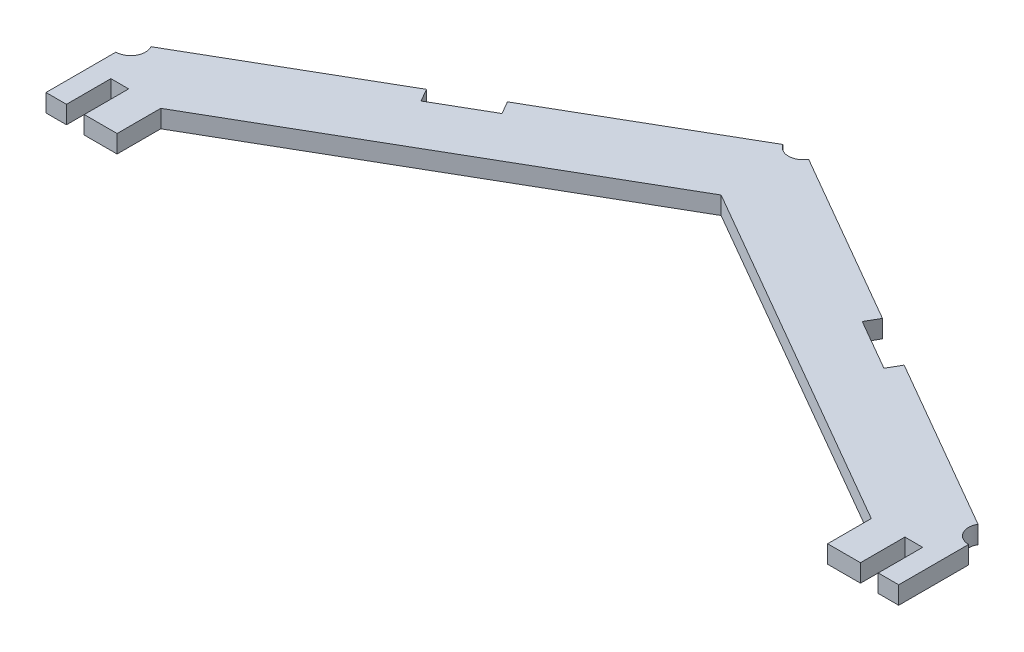
ISO-10303-21;
HEADER;
FILE_DESCRIPTION(('STEP AP214'),'2;1');
FILE_NAME('part.step','',(''),(''),'','','');
FILE_SCHEMA(('AUTOMOTIVE_DESIGN { 1 0 10303 214 1 1 1 1 }'));
ENDSEC;
DATA;
#1=APPLICATION_CONTEXT('core data for automotive mechanical design processes');
#2=APPLICATION_PROTOCOL_DEFINITION('international standard','automotive_design',2000,#1);
#3=PRODUCT_CONTEXT('',#1,'mechanical');
#4=PRODUCT('Part','Part','',(#3));
#5=PRODUCT_RELATED_PRODUCT_CATEGORY('part','',(#4));
#6=PRODUCT_DEFINITION_FORMATION('','',#4);
#7=PRODUCT_DEFINITION_CONTEXT('part definition',#1,'design');
#8=PRODUCT_DEFINITION('design','',#6,#7);
#9=PRODUCT_DEFINITION_SHAPE('','',#8);
#10=(LENGTH_UNIT() NAMED_UNIT(*) SI_UNIT(.MILLI.,.METRE.));
#11=(NAMED_UNIT(*) PLANE_ANGLE_UNIT() SI_UNIT($,.RADIAN.));
#12=(NAMED_UNIT(*) SI_UNIT($,.STERADIAN.) SOLID_ANGLE_UNIT());
#13=UNCERTAINTY_MEASURE_WITH_UNIT(LENGTH_MEASURE(1.E-05),#10,'distance_accuracy_value','');
#14=(GEOMETRIC_REPRESENTATION_CONTEXT(3) GLOBAL_UNCERTAINTY_ASSIGNED_CONTEXT((#13)) GLOBAL_UNIT_ASSIGNED_CONTEXT((#10,
#11,#12)) REPRESENTATION_CONTEXT('',''));
#15=CARTESIAN_POINT('',(0.,0.,0.));
#16=DIRECTION('',(0.,0.,1.));
#17=DIRECTION('',(1.,0.,0.));
#18=AXIS2_PLACEMENT_3D('',#15,#16,#17);
#19=CARTESIAN_POINT('',(-71.9715242270662,-21.,-27.25));
#20=DIRECTION('',(0.,-1.,0.));
#21=DIRECTION('',(0.,0.,-1.));
#22=AXIS2_PLACEMENT_3D('',#19,#20,#21);
#23=PLANE('',#22);
#24=DIRECTION('',(0.866025403784439,0.,0.5));
#25=VECTOR('',#24,1.);
#26=CARTESIAN_POINT('',(71.9615242270662,-21.,-41.5470053837925));
#27=LINE('',#26,#25);
#28=CARTESIAN_POINT('',(40.3108891324556,-21.,-59.8205080756885));
#29=VERTEX_POINT('',#28);
#30=CARTESIAN_POINT('',(69.7964607176053,-21.,-42.7970053837924));
#31=VERTEX_POINT('',#30);
#32=EDGE_CURVE('E482',#29,#31,#27,.T.);
#33=ORIENTED_EDGE('',*,*,#32,.F.);
#34=DIRECTION('',(0.500000000000006,0.,-0.866025403784435));
#35=VECTOR('',#34,1.);
#36=CARTESIAN_POINT('',(39.0608891324556,-21.,-57.6554445662274));
#37=LINE('',#36,#35);
#38=CARTESIAN_POINT('',(39.0608891324556,-21.,-57.6554445662274));
#39=VERTEX_POINT('',#38);
#40=EDGE_CURVE('E480',#39,#29,#37,.T.);
#41=ORIENTED_EDGE('',*,*,#40,.F.);
#42=DIRECTION('',(0.866025403784436,0.,0.500000000000005));
#43=VECTOR('',#42,1.);
#44=CARTESIAN_POINT('',(39.0608891324556,-21.,-57.6554445662274));
#45=LINE('',#44,#43);
#46=CARTESIAN_POINT('',(30.4006350946112,-21.,-62.6554445662274));
#47=VERTEX_POINT('',#46);
#48=EDGE_CURVE('E478',#47,#39,#45,.T.);
#49=ORIENTED_EDGE('',*,*,#48,.F.);
#50=DIRECTION('',(-0.500000000000005,0.,0.866025403784436));
#51=VECTOR('',#50,1.);
#52=CARTESIAN_POINT('',(30.4006350946112,-21.,-62.6554445662274));
#53=LINE('',#52,#51);
#54=CARTESIAN_POINT('',(31.6506350946112,-21.,-64.8205080756885));
#55=VERTEX_POINT('',#54);
#56=EDGE_CURVE('E476',#55,#47,#53,.T.);
#57=ORIENTED_EDGE('',*,*,#56,.F.);
#58=DIRECTION('',(0.866025403784439,0.,0.5));
#59=VECTOR('',#58,1.);
#60=CARTESIAN_POINT('',(71.9615242270662,-21.,-41.5470053837925));
#61=LINE('',#60,#59);
#62=CARTESIAN_POINT('',(2.1650635094611,-21.,-81.8440107675849));
#63=VERTEX_POINT('',#62);
#64=EDGE_CURVE('E474',#63,#55,#61,.T.);
#65=ORIENTED_EDGE('',*,*,#64,.F.);
#66=CARTESIAN_POINT('',(0.,-21.,-83.0940107675849));
#67=DIRECTION('',(0.,-1.,0.));
#68=DIRECTION('',(0.,0.,-1.));
#69=AXIS2_PLACEMENT_3D('',#66,#67,#68);
#70=CIRCLE('',#69,2.5);
#71=CARTESIAN_POINT('',(-2.16506350946109,-21.,-81.8440107675849));
#72=VERTEX_POINT('',#71);
#73=EDGE_CURVE('E472',#72,#63,#70,.F.);
#74=ORIENTED_EDGE('',*,*,#73,.F.);
#75=DIRECTION('',(0.866025403784439,0.,-0.5));
#76=VECTOR('',#75,1.);
#77=CARTESIAN_POINT('',(0.,-21.,-83.0940107675849));
#78=LINE('',#77,#76);
#79=CARTESIAN_POINT('',(-31.6506350946108,-21.,-64.8205080756888));
#80=VERTEX_POINT('',#79);
#81=EDGE_CURVE('E470',#80,#72,#78,.T.);
#82=ORIENTED_EDGE('',*,*,#81,.F.);
#83=DIRECTION('',(-0.499999999999999,0.,-0.866025403784439));
#84=VECTOR('',#83,1.);
#85=CARTESIAN_POINT('',(-30.4006350946108,-21.,-62.6554445662276));
#86=LINE('',#85,#84);
#87=CARTESIAN_POINT('',(-30.4006350946108,-21.,-62.6554445662276));
#88=VERTEX_POINT('',#87);
#89=EDGE_CURVE('E468',#88,#80,#86,.T.);
#90=ORIENTED_EDGE('',*,*,#89,.F.);
#91=DIRECTION('',(0.86602540378444,0.,-0.499999999999998));
#92=VECTOR('',#91,1.);
#93=CARTESIAN_POINT('',(-30.4006350946108,-21.,-62.6554445662276));
#94=LINE('',#93,#92);
#95=CARTESIAN_POINT('',(-39.0608891324552,-21.,-57.6554445662277));
#96=VERTEX_POINT('',#95);
#97=EDGE_CURVE('E466',#96,#88,#94,.T.);
#98=ORIENTED_EDGE('',*,*,#97,.F.);
#99=DIRECTION('',(0.499999999999999,0.,0.866025403784439));
#100=VECTOR('',#99,1.);
#101=CARTESIAN_POINT('',(-39.0608891324552,-21.,-57.6554445662277));
#102=LINE('',#101,#100);
#103=CARTESIAN_POINT('',(-40.3108891324552,-21.,-59.8205080756888));
#104=VERTEX_POINT('',#103);
#105=EDGE_CURVE('E464',#104,#96,#102,.T.);
#106=ORIENTED_EDGE('',*,*,#105,.F.);
#107=DIRECTION('',(0.866025403784439,0.,-0.5));
#108=VECTOR('',#107,1.);
#109=CARTESIAN_POINT('',(0.,-21.,-83.0940107675849));
#110=LINE('',#109,#108);
#111=CARTESIAN_POINT('',(-69.7964607176044,-21.,-42.7970053837929));
#112=VERTEX_POINT('',#111);
#113=EDGE_CURVE('E460',#112,#104,#110,.T.);
#114=ORIENTED_EDGE('',*,*,#113,.F.);
#115=CARTESIAN_POINT('',(-71.9615242270657,-21.,-41.5470053837933));
#116=DIRECTION('',(0.,-1.,0.));
#117=DIRECTION('',(0.,0.,-1.));
#118=AXIS2_PLACEMENT_3D('',#115,#116,#117);
#119=CIRCLE('',#118,2.5);
#120=CARTESIAN_POINT('',(-71.9615242270662,-21.,-39.0470053837933));
#121=VERTEX_POINT('',#120);
#122=EDGE_CURVE('E454',#121,#112,#119,.F.);
#123=ORIENTED_EDGE('',*,*,#122,.F.);
#124=DIRECTION('',(0.,0.,-1.));
#125=VECTOR('',#124,1.);
#126=CARTESIAN_POINT('',(-71.9615242270662,-21.,-41.5470053837925));
#127=LINE('',#126,#125);
#128=CARTESIAN_POINT('',(-71.9615242270662,-21.,-27.25));
#129=VERTEX_POINT('',#128);
#130=EDGE_CURVE('E451',#129,#121,#127,.T.);
#131=ORIENTED_EDGE('',*,*,#130,.F.);
#132=DIRECTION('',(1.,0.,0.));
#133=VECTOR('',#132,1.);
#134=CARTESIAN_POINT('',(-113.272742430532,-21.,-27.25));
#135=LINE('',#134,#133);
#136=CARTESIAN_POINT('',(-68.5064315060166,-21.,-27.25));
#137=VERTEX_POINT('',#136);
#138=EDGE_CURVE('E416',#129,#137,#135,.T.);
#139=ORIENTED_EDGE('',*,*,#138,.T.);
#140=DIRECTION('',(0.,0.,1.));
#141=VECTOR('',#140,1.);
#142=CARTESIAN_POINT('',(-68.5064315060166,-21.,-34.75));
#143=LINE('',#142,#141);
#144=CARTESIAN_POINT('',(-68.5064315060166,-21.,-34.75));
#145=VERTEX_POINT('',#144);
#146=EDGE_CURVE('E443',#145,#137,#143,.T.);
#147=ORIENTED_EDGE('',*,*,#146,.F.);
#148=DIRECTION('',(-1.,0.,0.));
#149=VECTOR('',#148,1.);
#150=CARTESIAN_POINT('',(-68.5064315060166,-21.,-34.75));
#151=LINE('',#150,#149);
#152=CARTESIAN_POINT('',(-65.5064315060166,-21.,-34.75));
#153=VERTEX_POINT('',#152);
#154=EDGE_CURVE('E446',#153,#145,#151,.T.);
#155=ORIENTED_EDGE('',*,*,#154,.F.);
#156=DIRECTION('',(0.,0.,-1.));
#157=VECTOR('',#156,1.);
#158=CARTESIAN_POINT('',(-65.5064315060166,-21.,-34.75));
#159=LINE('',#158,#157);
#160=CARTESIAN_POINT('',(-65.5064315060166,-21.,-27.25));
#161=VERTEX_POINT('',#160);
#162=EDGE_CURVE('E67',#161,#153,#159,.T.);
#163=ORIENTED_EDGE('',*,*,#162,.F.);
#164=DIRECTION('',(1.,0.,0.));
#165=VECTOR('',#164,1.);
#166=CARTESIAN_POINT('',(-113.272742430532,-21.,-27.25));
#167=LINE('',#166,#165);
#168=CARTESIAN_POINT('',(-59.9615242270663,-21.,-27.25));
#169=VERTEX_POINT('',#168);
#170=EDGE_CURVE('E60',#161,#169,#167,.T.);
#171=ORIENTED_EDGE('',*,*,#170,.T.);
#172=DIRECTION('',(0.,0.,-1.));
#173=VECTOR('',#172,1.);
#174=CARTESIAN_POINT('',(-59.9615242270663,-21.,34.6188021535168));
#175=LINE('',#174,#173);
#176=CARTESIAN_POINT('',(-59.9615242270663,-21.,-34.6188021535169));
#177=VERTEX_POINT('',#176);
#178=EDGE_CURVE('E238',#169,#177,#175,.T.);
#179=ORIENTED_EDGE('',*,*,#178,.T.);
#180=DIRECTION('',(0.866025403784439,0.,-0.5));
#181=VECTOR('',#180,1.);
#182=CARTESIAN_POINT('',(-59.9615242270663,-21.,-34.6188021535169));
#183=LINE('',#182,#181);
#184=CARTESIAN_POINT('',(0.,-21.,-69.2376043070339));
#185=VERTEX_POINT('',#184);
#186=EDGE_CURVE('E333',#177,#185,#183,.T.);
#187=ORIENTED_EDGE('',*,*,#186,.T.);
#188=DIRECTION('',(0.866025403784439,0.,0.5));
#189=VECTOR('',#188,1.);
#190=CARTESIAN_POINT('',(0.,-21.,-69.2376043070339));
#191=LINE('',#190,#189);
#192=CARTESIAN_POINT('',(59.9615242270662,-21.,-34.618802153517));
#193=VERTEX_POINT('',#192);
#194=EDGE_CURVE('E249',#185,#193,#191,.T.);
#195=ORIENTED_EDGE('',*,*,#194,.T.);
#196=DIRECTION('',(0.,0.,1.));
#197=VECTOR('',#196,1.);
#198=CARTESIAN_POINT('',(59.9615242270662,-21.,-34.618802153517));
#199=LINE('',#198,#197);
#200=CARTESIAN_POINT('',(59.9615242270662,-21.,-27.25));
#201=VERTEX_POINT('',#200);
#202=EDGE_CURVE('E47',#193,#201,#199,.T.);
#203=ORIENTED_EDGE('',*,*,#202,.T.);
#204=DIRECTION('',(1.,0.,0.));
#205=VECTOR('',#204,1.);
#206=CARTESIAN_POINT('',(-113.272742430532,-21.,-27.25));
#207=LINE('',#206,#205);
#208=CARTESIAN_POINT('',(65.5064315060166,-21.,-27.25));
#209=VERTEX_POINT('',#208);
#210=EDGE_CURVE('E248',#201,#209,#207,.T.);
#211=ORIENTED_EDGE('',*,*,#210,.T.);
#212=DIRECTION('',(0.,0.,1.));
#213=VECTOR('',#212,1.);
#214=CARTESIAN_POINT('',(65.5064315060166,-21.,-34.75));
#215=LINE('',#214,#213);
#216=CARTESIAN_POINT('',(65.5064315060166,-21.,-34.75));
#217=VERTEX_POINT('',#216);
#218=EDGE_CURVE('E437',#217,#209,#215,.T.);
#219=ORIENTED_EDGE('',*,*,#218,.F.);
#220=DIRECTION('',(-1.,0.,0.));
#221=VECTOR('',#220,1.);
#222=CARTESIAN_POINT('',(68.5064315060166,-21.,-34.75));
#223=LINE('',#222,#221);
#224=CARTESIAN_POINT('',(68.5064315060166,-21.,-34.75));
#225=VERTEX_POINT('',#224);
#226=EDGE_CURVE('E354',#225,#217,#223,.T.);
#227=ORIENTED_EDGE('',*,*,#226,.F.);
#228=DIRECTION('',(0.,0.,-1.));
#229=VECTOR('',#228,1.);
#230=CARTESIAN_POINT('',(68.5064315060166,-21.,-34.75));
#231=LINE('',#230,#229);
#232=CARTESIAN_POINT('',(68.5064315060166,-21.,-27.25));
#233=VERTEX_POINT('',#232);
#234=EDGE_CURVE('E444',#233,#225,#231,.T.);
#235=ORIENTED_EDGE('',*,*,#234,.F.);
#236=DIRECTION('',(1.,0.,0.));
#237=VECTOR('',#236,1.);
#238=CARTESIAN_POINT('',(-113.272742430532,-21.,-27.25));
#239=LINE('',#238,#237);
#240=CARTESIAN_POINT('',(71.9615242270662,-21.,-27.25));
#241=VERTEX_POINT('',#240);
#242=EDGE_CURVE('E338',#233,#241,#239,.T.);
#243=ORIENTED_EDGE('',*,*,#242,.T.);
#244=DIRECTION('',(0.,0.,1.));
#245=VECTOR('',#244,1.);
#246=CARTESIAN_POINT('',(71.9615242270662,-21.,41.5470053837925));
#247=LINE('',#246,#245);
#248=CARTESIAN_POINT('',(71.9615242270662,-21.,-39.0470053837923));
#249=VERTEX_POINT('',#248);
#250=EDGE_CURVE('E355',#249,#241,#247,.T.);
#251=ORIENTED_EDGE('',*,*,#250,.F.);
#252=CARTESIAN_POINT('',(71.9615242270663,-21.,-41.5470053837923));
#253=DIRECTION('',(0.,-1.,0.));
#254=DIRECTION('',(0.,0.,-1.));
#255=AXIS2_PLACEMENT_3D('',#252,#253,#254);
#256=CIRCLE('',#255,2.5);
#257=EDGE_CURVE('E352',#31,#249,#256,.F.);
#258=ORIENTED_EDGE('',*,*,#257,.F.);
#259=EDGE_LOOP('',(#33,#41,#49,#57,#65,#74,#82,#90,#98,#106,#114,#123,#131,#139,#147,#155,#163,
#171,#179,#187,#195,#203,#211,#219,#227,#235,#243,#251,#258));
#260=FACE_BOUND('',#259,.T.);
#261=ADVANCED_FACE('F43',(#260),#23,.F.);
#262=CARTESIAN_POINT('',(-71.9715242270662,-24.,-27.25));
#263=DIRECTION('',(0.,-1.,0.));
#264=DIRECTION('',(0.,0.,-1.));
#265=AXIS2_PLACEMENT_3D('',#262,#263,#264);
#266=PLANE('',#265);
#267=DIRECTION('',(0.866025403784439,0.,0.5));
#268=VECTOR('',#267,1.);
#269=CARTESIAN_POINT('',(71.9615242270662,-24.,-41.5470053837925));
#270=LINE('',#269,#268);
#271=CARTESIAN_POINT('',(40.3108891324556,-24.,-59.8205080756885));
#272=VERTEX_POINT('',#271);
#273=CARTESIAN_POINT('',(69.7964607176053,-24.,-42.7970053837924));
#274=VERTEX_POINT('',#273);
#275=EDGE_CURVE('E327',#272,#274,#270,.T.);
#276=ORIENTED_EDGE('',*,*,#275,.T.);
#277=CARTESIAN_POINT('',(71.9615242270663,-24.,-41.5470053837923));
#278=DIRECTION('',(0.,-1.,0.));
#279=DIRECTION('',(0.,0.,-1.));
#280=AXIS2_PLACEMENT_3D('',#277,#278,#279);
#281=CIRCLE('',#280,2.5);
#282=CARTESIAN_POINT('',(71.9615242270662,-24.,-39.0470053837923));
#283=VERTEX_POINT('',#282);
#284=EDGE_CURVE('E330',#274,#283,#281,.F.);
#285=ORIENTED_EDGE('',*,*,#284,.T.);
#286=DIRECTION('',(0.,0.,1.));
#287=VECTOR('',#286,1.);
#288=CARTESIAN_POINT('',(71.9615242270662,-24.,41.5470053837925));
#289=LINE('',#288,#287);
#290=CARTESIAN_POINT('',(71.9615242270662,-24.,-27.25));
#291=VERTEX_POINT('',#290);
#292=EDGE_CURVE('E288',#283,#291,#289,.T.);
#293=ORIENTED_EDGE('',*,*,#292,.T.);
#294=DIRECTION('',(1.,0.,0.));
#295=VECTOR('',#294,1.);
#296=CARTESIAN_POINT('',(-113.272742430532,-24.,-27.25));
#297=LINE('',#296,#295);
#298=CARTESIAN_POINT('',(68.5064315060166,-24.,-27.25));
#299=VERTEX_POINT('',#298);
#300=EDGE_CURVE('E334',#299,#291,#297,.T.);
#301=ORIENTED_EDGE('',*,*,#300,.F.);
#302=DIRECTION('',(0.,0.,-1.));
#303=VECTOR('',#302,1.);
#304=CARTESIAN_POINT('',(68.5064315060166,-24.,-34.75));
#305=LINE('',#304,#303);
#306=CARTESIAN_POINT('',(68.5064315060166,-24.,-34.75));
#307=VERTEX_POINT('',#306);
#308=EDGE_CURVE('E282',#299,#307,#305,.T.);
#309=ORIENTED_EDGE('',*,*,#308,.T.);
#310=DIRECTION('',(-1.,0.,0.));
#311=VECTOR('',#310,1.);
#312=CARTESIAN_POINT('',(68.5064315060166,-24.,-34.75));
#313=LINE('',#312,#311);
#314=CARTESIAN_POINT('',(65.5064315060166,-24.,-34.75));
#315=VERTEX_POINT('',#314);
#316=EDGE_CURVE('E285',#307,#315,#313,.T.);
#317=ORIENTED_EDGE('',*,*,#316,.T.);
#318=DIRECTION('',(0.,0.,1.));
#319=VECTOR('',#318,1.);
#320=CARTESIAN_POINT('',(65.5064315060166,-24.,-34.75));
#321=LINE('',#320,#319);
#322=CARTESIAN_POINT('',(65.5064315060166,-24.,-27.25));
#323=VERTEX_POINT('',#322);
#324=EDGE_CURVE('E279',#315,#323,#321,.T.);
#325=ORIENTED_EDGE('',*,*,#324,.T.);
#326=DIRECTION('',(1.,0.,0.));
#327=VECTOR('',#326,1.);
#328=CARTESIAN_POINT('',(-113.272742430532,-24.,-27.25));
#329=LINE('',#328,#327);
#330=CARTESIAN_POINT('',(59.9615242270662,-24.,-27.25));
#331=VERTEX_POINT('',#330);
#332=EDGE_CURVE('E341',#331,#323,#329,.T.);
#333=ORIENTED_EDGE('',*,*,#332,.F.);
#334=DIRECTION('',(0.,0.,1.));
#335=VECTOR('',#334,1.);
#336=CARTESIAN_POINT('',(59.9615242270662,-24.,-34.618802153517));
#337=LINE('',#336,#335);
#338=CARTESIAN_POINT('',(59.9615242270662,-24.,-34.618802153517));
#339=VERTEX_POINT('',#338);
#340=EDGE_CURVE('E353',#339,#331,#337,.T.);
#341=ORIENTED_EDGE('',*,*,#340,.F.);
#342=DIRECTION('',(0.866025403784439,0.,0.5));
#343=VECTOR('',#342,1.);
#344=CARTESIAN_POINT('',(0.,-24.,-69.2376043070339));
#345=LINE('',#344,#343);
#346=CARTESIAN_POINT('',(0.,-24.,-69.2376043070339));
#347=VERTEX_POINT('',#346);
#348=EDGE_CURVE('E345',#347,#339,#345,.T.);
#349=ORIENTED_EDGE('',*,*,#348,.F.);
#350=DIRECTION('',(0.866025403784439,0.,-0.5));
#351=VECTOR('',#350,1.);
#352=CARTESIAN_POINT('',(-59.9615242270663,-24.,-34.6188021535169));
#353=LINE('',#352,#351);
#354=CARTESIAN_POINT('',(-59.9615242270663,-24.,-34.6188021535169));
#355=VERTEX_POINT('',#354);
#356=EDGE_CURVE('E350',#355,#347,#353,.T.);
#357=ORIENTED_EDGE('',*,*,#356,.F.);
#358=DIRECTION('',(0.,0.,-1.));
#359=VECTOR('',#358,1.);
#360=CARTESIAN_POINT('',(-59.9615242270663,-24.,34.6188021535168));
#361=LINE('',#360,#359);
#362=CARTESIAN_POINT('',(-59.9615242270663,-24.,-27.25));
#363=VERTEX_POINT('',#362);
#364=EDGE_CURVE('E348',#363,#355,#361,.T.);
#365=ORIENTED_EDGE('',*,*,#364,.F.);
#366=DIRECTION('',(1.,0.,0.));
#367=VECTOR('',#366,1.);
#368=CARTESIAN_POINT('',(-113.272742430532,-24.,-27.25));
#369=LINE('',#368,#367);
#370=CARTESIAN_POINT('',(-65.5064315060166,-24.,-27.25));
#371=VERTEX_POINT('',#370);
#372=EDGE_CURVE('E254',#371,#363,#369,.T.);
#373=ORIENTED_EDGE('',*,*,#372,.F.);
#374=DIRECTION('',(0.,0.,-1.));
#375=VECTOR('',#374,1.);
#376=CARTESIAN_POINT('',(-65.5064315060166,-24.,-34.75));
#377=LINE('',#376,#375);
#378=CARTESIAN_POINT('',(-65.5064315060166,-24.,-34.75));
#379=VERTEX_POINT('',#378);
#380=EDGE_CURVE('E246',#371,#379,#377,.T.);
#381=ORIENTED_EDGE('',*,*,#380,.T.);
#382=DIRECTION('',(-1.,0.,0.));
#383=VECTOR('',#382,1.);
#384=CARTESIAN_POINT('',(-68.5064315060166,-24.,-34.75));
#385=LINE('',#384,#383);
#386=CARTESIAN_POINT('',(-68.5064315060166,-24.,-34.75));
#387=VERTEX_POINT('',#386);
#388=EDGE_CURVE('E273',#379,#387,#385,.T.);
#389=ORIENTED_EDGE('',*,*,#388,.T.);
#390=DIRECTION('',(0.,0.,1.));
#391=VECTOR('',#390,1.);
#392=CARTESIAN_POINT('',(-68.5064315060166,-24.,-34.75));
#393=LINE('',#392,#391);
#394=CARTESIAN_POINT('',(-68.5064315060166,-24.,-27.25));
#395=VERTEX_POINT('',#394);
#396=EDGE_CURVE('E276',#387,#395,#393,.T.);
#397=ORIENTED_EDGE('',*,*,#396,.T.);
#398=DIRECTION('',(1.,0.,0.));
#399=VECTOR('',#398,1.);
#400=CARTESIAN_POINT('',(-113.272742430532,-24.,-27.25));
#401=LINE('',#400,#399);
#402=CARTESIAN_POINT('',(-71.9615242270662,-24.,-27.25));
#403=VERTEX_POINT('',#402);
#404=EDGE_CURVE('E337',#403,#395,#401,.T.);
#405=ORIENTED_EDGE('',*,*,#404,.F.);
#406=DIRECTION('',(0.,0.,-1.));
#407=VECTOR('',#406,1.);
#408=CARTESIAN_POINT('',(-71.9615242270662,-24.,-41.5470053837925));
#409=LINE('',#408,#407);
#410=CARTESIAN_POINT('',(-71.9615242270662,-24.,-39.0470053837933));
#411=VERTEX_POINT('',#410);
#412=EDGE_CURVE('E291',#403,#411,#409,.T.);
#413=ORIENTED_EDGE('',*,*,#412,.T.);
#414=CARTESIAN_POINT('',(-71.9615242270657,-24.,-41.5470053837933));
#415=DIRECTION('',(0.,-1.,0.));
#416=DIRECTION('',(0.,0.,-1.));
#417=AXIS2_PLACEMENT_3D('',#414,#415,#416);
#418=CIRCLE('',#417,2.5);
#419=CARTESIAN_POINT('',(-69.7964607176044,-24.,-42.7970053837929));
#420=VERTEX_POINT('',#419);
#421=EDGE_CURVE('E294',#411,#420,#418,.F.);
#422=ORIENTED_EDGE('',*,*,#421,.T.);
#423=DIRECTION('',(0.866025403784439,0.,-0.5));
#424=VECTOR('',#423,1.);
#425=CARTESIAN_POINT('',(0.,-24.,-83.0940107675849));
#426=LINE('',#425,#424);
#427=CARTESIAN_POINT('',(-40.3108891324552,-24.,-59.8205080756888));
#428=VERTEX_POINT('',#427);
#429=EDGE_CURVE('E297',#420,#428,#426,.T.);
#430=ORIENTED_EDGE('',*,*,#429,.T.);
#431=DIRECTION('',(0.499999999999999,0.,0.866025403784439));
#432=VECTOR('',#431,1.);
#433=CARTESIAN_POINT('',(-39.0608891324552,-24.,-57.6554445662277));
#434=LINE('',#433,#432);
#435=CARTESIAN_POINT('',(-39.0608891324552,-24.,-57.6554445662277));
#436=VERTEX_POINT('',#435);
#437=EDGE_CURVE('E300',#428,#436,#434,.T.);
#438=ORIENTED_EDGE('',*,*,#437,.T.);
#439=DIRECTION('',(0.86602540378444,0.,-0.499999999999998));
#440=VECTOR('',#439,1.);
#441=CARTESIAN_POINT('',(-30.4006350946108,-24.,-62.6554445662276));
#442=LINE('',#441,#440);
#443=CARTESIAN_POINT('',(-30.4006350946108,-24.,-62.6554445662276));
#444=VERTEX_POINT('',#443);
#445=EDGE_CURVE('E303',#436,#444,#442,.T.);
#446=ORIENTED_EDGE('',*,*,#445,.T.);
#447=DIRECTION('',(-0.499999999999999,0.,-0.866025403784439));
#448=VECTOR('',#447,1.);
#449=CARTESIAN_POINT('',(-30.4006350946108,-24.,-62.6554445662276));
#450=LINE('',#449,#448);
#451=CARTESIAN_POINT('',(-31.6506350946108,-24.,-64.8205080756888));
#452=VERTEX_POINT('',#451);
#453=EDGE_CURVE('E306',#444,#452,#450,.T.);
#454=ORIENTED_EDGE('',*,*,#453,.T.);
#455=DIRECTION('',(0.866025403784439,0.,-0.5));
#456=VECTOR('',#455,1.);
#457=CARTESIAN_POINT('',(0.,-24.,-83.0940107675849));
#458=LINE('',#457,#456);
#459=CARTESIAN_POINT('',(-2.16506350946109,-24.,-81.8440107675849));
#460=VERTEX_POINT('',#459);
#461=EDGE_CURVE('E309',#452,#460,#458,.T.);
#462=ORIENTED_EDGE('',*,*,#461,.T.);
#463=CARTESIAN_POINT('',(0.,-24.,-83.0940107675849));
#464=DIRECTION('',(0.,-1.,0.));
#465=DIRECTION('',(0.,0.,-1.));
#466=AXIS2_PLACEMENT_3D('',#463,#464,#465);
#467=CIRCLE('',#466,2.5);
#468=CARTESIAN_POINT('',(2.1650635094611,-24.,-81.8440107675849));
#469=VERTEX_POINT('',#468);
#470=EDGE_CURVE('E312',#460,#469,#467,.F.);
#471=ORIENTED_EDGE('',*,*,#470,.T.);
#472=DIRECTION('',(0.866025403784439,0.,0.5));
#473=VECTOR('',#472,1.);
#474=CARTESIAN_POINT('',(71.9615242270662,-24.,-41.5470053837925));
#475=LINE('',#474,#473);
#476=CARTESIAN_POINT('',(31.6506350946112,-24.,-64.8205080756885));
#477=VERTEX_POINT('',#476);
#478=EDGE_CURVE('E315',#469,#477,#475,.T.);
#479=ORIENTED_EDGE('',*,*,#478,.T.);
#480=DIRECTION('',(-0.500000000000005,0.,0.866025403784436));
#481=VECTOR('',#480,1.);
#482=CARTESIAN_POINT('',(30.4006350946112,-24.,-62.6554445662274));
#483=LINE('',#482,#481);
#484=CARTESIAN_POINT('',(30.4006350946112,-24.,-62.6554445662274));
#485=VERTEX_POINT('',#484);
#486=EDGE_CURVE('E318',#477,#485,#483,.T.);
#487=ORIENTED_EDGE('',*,*,#486,.T.);
#488=DIRECTION('',(0.866025403784436,0.,0.500000000000005));
#489=VECTOR('',#488,1.);
#490=CARTESIAN_POINT('',(39.0608891324556,-24.,-57.6554445662274));
#491=LINE('',#490,#489);
#492=CARTESIAN_POINT('',(39.0608891324556,-24.,-57.6554445662274));
#493=VERTEX_POINT('',#492);
#494=EDGE_CURVE('E321',#485,#493,#491,.T.);
#495=ORIENTED_EDGE('',*,*,#494,.T.);
#496=DIRECTION('',(0.500000000000006,0.,-0.866025403784435));
#497=VECTOR('',#496,1.);
#498=CARTESIAN_POINT('',(39.0608891324556,-24.,-57.6554445662274));
#499=LINE('',#498,#497);
#500=EDGE_CURVE('E324',#493,#272,#499,.T.);
#501=ORIENTED_EDGE('',*,*,#500,.T.);
#502=EDGE_LOOP('',(#276,#285,#293,#301,#309,#317,#325,#333,#341,#349,#357,#365,#373,#381,#389,
#397,#405,#413,#422,#430,#438,#446,#454,#462,#471,#479,#487,#495,#501));
#503=FACE_BOUND('',#502,.T.);
#504=ADVANCED_FACE('F494',(#503),#266,.T.);
#505=CARTESIAN_POINT('',(-113.272742430532,-42.01,-27.25));
#506=DIRECTION('',(0.,0.,1.));
#507=DIRECTION('',(1.,0.,0.));
#508=AXIS2_PLACEMENT_3D('',#505,#506,#507);
#509=PLANE('',#508);
#510=ORIENTED_EDGE('',*,*,#210,.F.);
#511=DIRECTION('',(0.,1.,0.));
#512=VECTOR('',#511,1.);
#513=CARTESIAN_POINT('',(59.9615242270662,-27.,-27.25));
#514=LINE('',#513,#512);
#515=EDGE_CURVE('E256',#331,#201,#514,.T.);
#516=ORIENTED_EDGE('',*,*,#515,.F.);
#517=ORIENTED_EDGE('',*,*,#332,.T.);
#518=DIRECTION('',(0.,-1.,0.));
#519=VECTOR('',#518,1.);
#520=CARTESIAN_POINT('',(65.5064315060166,-42.01,-27.25));
#521=LINE('',#520,#519);
#522=EDGE_CURVE('E365',#209,#323,#521,.T.);
#523=ORIENTED_EDGE('',*,*,#522,.F.);
#524=EDGE_LOOP('',(#510,#516,#517,#523));
#525=FACE_BOUND('',#524,.T.);
#526=ADVANCED_FACE('F439',(#525),#509,.T.);
#527=CARTESIAN_POINT('',(68.5064315060166,-51.,-34.75));
#528=DIRECTION('',(0.,0.,-1.));
#529=DIRECTION('',(-1.,0.,0.));
#530=AXIS2_PLACEMENT_3D('',#527,#528,#529);
#531=PLANE('',#530);
#532=DIRECTION('',(0.,1.,0.));
#533=VECTOR('',#532,1.);
#534=CARTESIAN_POINT('',(68.5064315060166,-51.,-34.75));
#535=LINE('',#534,#533);
#536=EDGE_CURVE('E11',#307,#225,#535,.T.);
#537=ORIENTED_EDGE('',*,*,#536,.T.);
#538=ORIENTED_EDGE('',*,*,#226,.T.);
#539=DIRECTION('',(0.,1.,0.));
#540=VECTOR('',#539,1.);
#541=CARTESIAN_POINT('',(65.5064315060166,-51.,-34.75));
#542=LINE('',#541,#540);
#543=EDGE_CURVE('E52',#315,#217,#542,.T.);
#544=ORIENTED_EDGE('',*,*,#543,.F.);
#545=ORIENTED_EDGE('',*,*,#316,.F.);
#546=EDGE_LOOP('',(#537,#538,#544,#545));
#547=FACE_BOUND('',#546,.T.);
#548=ADVANCED_FACE('F563',(#547),#531,.F.);
#549=CARTESIAN_POINT('',(65.5064315060166,-51.,-34.75));
#550=DIRECTION('',(-1.,0.,0.));
#551=DIRECTION('',(0.,0.,1.));
#552=AXIS2_PLACEMENT_3D('',#549,#550,#551);
#553=PLANE('',#552);
#554=ORIENTED_EDGE('',*,*,#543,.T.);
#555=ORIENTED_EDGE('',*,*,#218,.T.);
#556=ORIENTED_EDGE('',*,*,#522,.T.);
#557=ORIENTED_EDGE('',*,*,#324,.F.);
#558=EDGE_LOOP('',(#554,#555,#556,#557));
#559=FACE_BOUND('',#558,.T.);
#560=ADVANCED_FACE('F442',(#559),#553,.F.);
#561=ORIENTED_EDGE('',*,*,#242,.F.);
#562=DIRECTION('',(0.,1.,0.));
#563=VECTOR('',#562,1.);
#564=CARTESIAN_POINT('',(68.5064315060166,-42.01,-27.25));
#565=LINE('',#564,#563);
#566=EDGE_CURVE('E367',#299,#233,#565,.T.);
#567=ORIENTED_EDGE('',*,*,#566,.F.);
#568=ORIENTED_EDGE('',*,*,#300,.T.);
#569=DIRECTION('',(0.,1.,0.));
#570=VECTOR('',#569,1.);
#571=CARTESIAN_POINT('',(71.9615242270662,9.,-27.25));
#572=LINE('',#571,#570);
#573=EDGE_CURVE('E258',#291,#241,#572,.T.);
#574=ORIENTED_EDGE('',*,*,#573,.T.);
#575=EDGE_LOOP('',(#561,#567,#568,#574));
#576=FACE_BOUND('',#575,.T.);
#577=ADVANCED_FACE('F567',(#576),#509,.T.);
#578=CARTESIAN_POINT('',(68.5064315060166,-51.,-34.75));
#579=DIRECTION('',(1.,0.,0.));
#580=DIRECTION('',(0.,0.,-1.));
#581=AXIS2_PLACEMENT_3D('',#578,#579,#580);
#582=PLANE('',#581);
#583=ORIENTED_EDGE('',*,*,#566,.T.);
#584=ORIENTED_EDGE('',*,*,#234,.T.);
#585=ORIENTED_EDGE('',*,*,#536,.F.);
#586=ORIENTED_EDGE('',*,*,#308,.F.);
#587=EDGE_LOOP('',(#583,#584,#585,#586));
#588=FACE_BOUND('',#587,.T.);
#589=ADVANCED_FACE('F565',(#588),#582,.F.);
#590=CARTESIAN_POINT('',(0.,-9.,-69.2376043070339));
#591=DIRECTION('',(-0.5,0.,0.866025403784439));
#592=DIRECTION('',(0.866025403784439,0.,0.5));
#593=AXIS2_PLACEMENT_3D('',#590,#591,#592);
#594=PLANE('',#593);
#595=ORIENTED_EDGE('',*,*,#194,.F.);
#596=DIRECTION('',(0.,1.,0.));
#597=VECTOR('',#596,1.);
#598=CARTESIAN_POINT('',(0.,-9.,-69.2376043070339));
#599=LINE('',#598,#597);
#600=EDGE_CURVE('E267',#347,#185,#599,.T.);
#601=ORIENTED_EDGE('',*,*,#600,.F.);
#602=ORIENTED_EDGE('',*,*,#348,.T.);
#603=DIRECTION('',(0.,1.,0.));
#604=VECTOR('',#603,1.);
#605=CARTESIAN_POINT('',(59.9615242270662,-27.,-34.618802153517));
#606=LINE('',#605,#604);
#607=EDGE_CURVE('E268',#339,#193,#606,.T.);
#608=ORIENTED_EDGE('',*,*,#607,.T.);
#609=EDGE_LOOP('',(#595,#601,#602,#608));
#610=FACE_BOUND('',#609,.T.);
#611=ADVANCED_FACE('F428',(#610),#594,.T.);
#612=CARTESIAN_POINT('',(59.9615242270662,-27.,-34.618802153517));
#613=DIRECTION('',(-1.,0.,0.));
#614=DIRECTION('',(0.,0.,1.));
#615=AXIS2_PLACEMENT_3D('',#612,#613,#614);
#616=PLANE('',#615);
#617=ORIENTED_EDGE('',*,*,#607,.F.);
#618=ORIENTED_EDGE('',*,*,#340,.T.);
#619=ORIENTED_EDGE('',*,*,#515,.T.);
#620=ORIENTED_EDGE('',*,*,#202,.F.);
#621=EDGE_LOOP('',(#617,#618,#619,#620));
#622=FACE_BOUND('',#621,.T.);
#623=ADVANCED_FACE('F431',(#622),#616,.T.);
#624=CARTESIAN_POINT('',(71.9615242270663,-41.,-41.5470053837923));
#625=DIRECTION('',(0.,1.,0.));
#626=DIRECTION('',(0.,0.,1.));
#627=AXIS2_PLACEMENT_3D('',#624,#625,#626);
#628=CYLINDRICAL_SURFACE('',#627,2.5);
#629=DIRECTION('',(0.,1.,0.));
#630=VECTOR('',#629,1.);
#631=CARTESIAN_POINT('',(69.7964607176053,-41.,-42.7970053837924));
#632=LINE('',#631,#630);
#633=EDGE_CURVE('E385',#31,#274,#632,.F.);
#634=ORIENTED_EDGE('',*,*,#633,.F.);
#635=ORIENTED_EDGE('',*,*,#257,.T.);
#636=DIRECTION('',(0.,1.,0.));
#637=VECTOR('',#636,1.);
#638=CARTESIAN_POINT('',(71.9615242270662,-41.,-39.0470053837923));
#639=LINE('',#638,#637);
#640=EDGE_CURVE('E387',#283,#249,#639,.T.);
#641=ORIENTED_EDGE('',*,*,#640,.F.);
#642=ORIENTED_EDGE('',*,*,#284,.F.);
#643=EDGE_LOOP('',(#634,#635,#641,#642));
#644=FACE_BOUND('',#643,.T.);
#645=ADVANCED_FACE('F487',(#644),#628,.F.);
#646=CARTESIAN_POINT('',(71.9615242270662,9.,41.5470053837925));
#647=DIRECTION('',(-1.,0.,0.));
#648=DIRECTION('',(0.,0.,1.));
#649=AXIS2_PLACEMENT_3D('',#646,#647,#648);
#650=PLANE('',#649);
#651=ORIENTED_EDGE('',*,*,#640,.T.);
#652=ORIENTED_EDGE('',*,*,#250,.T.);
#653=ORIENTED_EDGE('',*,*,#573,.F.);
#654=ORIENTED_EDGE('',*,*,#292,.F.);
#655=EDGE_LOOP('',(#651,#652,#653,#654));
#656=FACE_BOUND('',#655,.T.);
#657=ADVANCED_FACE('F491',(#656),#650,.F.);
#658=CARTESIAN_POINT('',(71.9615242270662,9.,-41.5470053837925));
#659=DIRECTION('',(-0.5,0.,0.866025403784439));
#660=DIRECTION('',(0.866025403784439,0.,0.5));
#661=AXIS2_PLACEMENT_3D('',#658,#659,#660);
#662=PLANE('',#661);
#663=DIRECTION('',(0.,1.,0.));
#664=VECTOR('',#663,1.);
#665=CARTESIAN_POINT('',(40.3108891324556,9.,-59.8205080756885));
#666=LINE('',#665,#664);
#667=EDGE_CURVE('E392',#272,#29,#666,.T.);
#668=ORIENTED_EDGE('',*,*,#667,.T.);
#669=ORIENTED_EDGE('',*,*,#32,.T.);
#670=ORIENTED_EDGE('',*,*,#633,.T.);
#671=ORIENTED_EDGE('',*,*,#275,.F.);
#672=EDGE_LOOP('',(#668,#669,#670,#671));
#673=FACE_BOUND('',#672,.T.);
#674=ADVANCED_FACE('F499',(#673),#662,.F.);
#675=CARTESIAN_POINT('',(39.0608891324556,-41.,-57.6554445662274));
#676=DIRECTION('',(0.866025403784435,0.,0.500000000000006));
#677=DIRECTION('',(0.500000000000006,0.,-0.866025403784435));
#678=AXIS2_PLACEMENT_3D('',#675,#676,#677);
#679=PLANE('',#678);
#680=DIRECTION('',(0.,1.,0.));
#681=VECTOR('',#680,1.);
#682=CARTESIAN_POINT('',(39.0608891324556,-41.,-57.6554445662274));
#683=LINE('',#682,#681);
#684=EDGE_CURVE('E406',#493,#39,#683,.T.);
#685=ORIENTED_EDGE('',*,*,#684,.T.);
#686=ORIENTED_EDGE('',*,*,#40,.T.);
#687=ORIENTED_EDGE('',*,*,#667,.F.);
#688=ORIENTED_EDGE('',*,*,#500,.F.);
#689=EDGE_LOOP('',(#685,#686,#687,#688));
#690=FACE_BOUND('',#689,.T.);
#691=ADVANCED_FACE('F504',(#690),#679,.F.);
#692=CARTESIAN_POINT('',(39.0608891324556,-41.,-57.6554445662274));
#693=DIRECTION('',(-0.500000000000005,0.,0.866025403784436));
#694=DIRECTION('',(0.866025403784436,0.,0.500000000000005));
#695=AXIS2_PLACEMENT_3D('',#692,#693,#694);
#696=PLANE('',#695);
#697=DIRECTION('',(0.,1.,0.));
#698=VECTOR('',#697,1.);
#699=CARTESIAN_POINT('',(30.4006350946112,-41.,-62.6554445662274));
#700=LINE('',#699,#698);
#701=EDGE_CURVE('E409',#485,#47,#700,.T.);
#702=ORIENTED_EDGE('',*,*,#701,.T.);
#703=ORIENTED_EDGE('',*,*,#48,.T.);
#704=ORIENTED_EDGE('',*,*,#684,.F.);
#705=ORIENTED_EDGE('',*,*,#494,.F.);
#706=EDGE_LOOP('',(#702,#703,#704,#705));
#707=FACE_BOUND('',#706,.T.);
#708=ADVANCED_FACE('F507',(#707),#696,.F.);
#709=CARTESIAN_POINT('',(30.4006350946112,-41.,-62.6554445662274));
#710=DIRECTION('',(-0.866025403784436,0.,-0.500000000000005));
#711=DIRECTION('',(-0.500000000000005,0.,0.866025403784436));
#712=AXIS2_PLACEMENT_3D('',#709,#710,#711);
#713=PLANE('',#712);
#714=DIRECTION('',(0.,-1.,0.));
#715=VECTOR('',#714,1.);
#716=CARTESIAN_POINT('',(31.6506350946112,9.,-64.8205080756885));
#717=LINE('',#716,#715);
#718=EDGE_CURVE('E390',#55,#477,#717,.T.);
#719=ORIENTED_EDGE('',*,*,#718,.F.);
#720=ORIENTED_EDGE('',*,*,#56,.T.);
#721=ORIENTED_EDGE('',*,*,#701,.F.);
#722=ORIENTED_EDGE('',*,*,#486,.F.);
#723=EDGE_LOOP('',(#719,#720,#721,#722));
#724=FACE_BOUND('',#723,.T.);
#725=ADVANCED_FACE('F511',(#724),#713,.F.);
#726=DIRECTION('',(0.,1.,0.));
#727=VECTOR('',#726,1.);
#728=CARTESIAN_POINT('',(2.1650635094611,-41.,-81.8440107675849));
#729=LINE('',#728,#727);
#730=EDGE_CURVE('E261',#469,#63,#729,.T.);
#731=ORIENTED_EDGE('',*,*,#730,.T.);
#732=ORIENTED_EDGE('',*,*,#64,.T.);
#733=ORIENTED_EDGE('',*,*,#718,.T.);
#734=ORIENTED_EDGE('',*,*,#478,.F.);
#735=EDGE_LOOP('',(#731,#732,#733,#734));
#736=FACE_BOUND('',#735,.T.);
#737=ADVANCED_FACE('F518',(#736),#662,.F.);
#738=CARTESIAN_POINT('',(0.,-41.,-83.0940107675849));
#739=DIRECTION('',(0.,1.,0.));
#740=DIRECTION('',(0.,0.,1.));
#741=AXIS2_PLACEMENT_3D('',#738,#739,#740);
#742=CYLINDRICAL_SURFACE('',#741,2.5);
#743=DIRECTION('',(0.,1.,0.));
#744=VECTOR('',#743,1.);
#745=CARTESIAN_POINT('',(-2.16506350946109,-41.,-81.8440107675849));
#746=LINE('',#745,#744);
#747=EDGE_CURVE('E378',#72,#460,#746,.F.);
#748=ORIENTED_EDGE('',*,*,#747,.F.);
#749=ORIENTED_EDGE('',*,*,#73,.T.);
#750=ORIENTED_EDGE('',*,*,#730,.F.);
#751=ORIENTED_EDGE('',*,*,#470,.F.);
#752=EDGE_LOOP('',(#748,#749,#750,#751));
#753=FACE_BOUND('',#752,.T.);
#754=ADVANCED_FACE('F521',(#753),#742,.F.);
#755=CARTESIAN_POINT('',(0.,9.,-83.0940107675849));
#756=DIRECTION('',(0.5,0.,0.866025403784439));
#757=DIRECTION('',(0.866025403784439,0.,-0.5));
#758=AXIS2_PLACEMENT_3D('',#755,#756,#757);
#759=PLANE('',#758);
#760=DIRECTION('',(0.,1.,0.));
#761=VECTOR('',#760,1.);
#762=CARTESIAN_POINT('',(-31.6506350946108,9.,-64.8205080756888));
#763=LINE('',#762,#761);
#764=EDGE_CURVE('E397',#452,#80,#763,.T.);
#765=ORIENTED_EDGE('',*,*,#764,.T.);
#766=ORIENTED_EDGE('',*,*,#81,.T.);
#767=ORIENTED_EDGE('',*,*,#747,.T.);
#768=ORIENTED_EDGE('',*,*,#461,.F.);
#769=EDGE_LOOP('',(#765,#766,#767,#768));
#770=FACE_BOUND('',#769,.T.);
#771=ADVANCED_FACE('F524',(#770),#759,.F.);
#772=CARTESIAN_POINT('',(-30.4006350946108,-41.,-62.6554445662276));
#773=DIRECTION('',(0.866025403784439,0.,-0.499999999999999));
#774=DIRECTION('',(-0.499999999999999,0.,-0.866025403784439));
#775=AXIS2_PLACEMENT_3D('',#772,#773,#774);
#776=PLANE('',#775);
#777=DIRECTION('',(0.,1.,0.));
#778=VECTOR('',#777,1.);
#779=CARTESIAN_POINT('',(-30.4006350946108,-41.,-62.6554445662276));
#780=LINE('',#779,#778);
#781=EDGE_CURVE('E403',#444,#88,#780,.T.);
#782=ORIENTED_EDGE('',*,*,#781,.T.);
#783=ORIENTED_EDGE('',*,*,#89,.T.);
#784=ORIENTED_EDGE('',*,*,#764,.F.);
#785=ORIENTED_EDGE('',*,*,#453,.F.);
#786=EDGE_LOOP('',(#782,#783,#784,#785));
#787=FACE_BOUND('',#786,.T.);
#788=ADVANCED_FACE('F530',(#787),#776,.F.);
#789=CARTESIAN_POINT('',(-30.4006350946108,-41.,-62.6554445662276));
#790=DIRECTION('',(0.499999999999998,0.,0.86602540378444));
#791=DIRECTION('',(0.86602540378444,0.,-0.499999999999998));
#792=AXIS2_PLACEMENT_3D('',#789,#790,#791);
#793=PLANE('',#792);
#794=DIRECTION('',(0.,1.,0.));
#795=VECTOR('',#794,1.);
#796=CARTESIAN_POINT('',(-39.0608891324552,-41.,-57.6554445662277));
#797=LINE('',#796,#795);
#798=EDGE_CURVE('E400',#436,#96,#797,.T.);
#799=ORIENTED_EDGE('',*,*,#798,.T.);
#800=ORIENTED_EDGE('',*,*,#97,.T.);
#801=ORIENTED_EDGE('',*,*,#781,.F.);
#802=ORIENTED_EDGE('',*,*,#445,.F.);
#803=EDGE_LOOP('',(#799,#800,#801,#802));
#804=FACE_BOUND('',#803,.T.);
#805=ADVANCED_FACE('F533',(#804),#793,.F.);
#806=CARTESIAN_POINT('',(-39.0608891324552,-41.,-57.6554445662277));
#807=DIRECTION('',(-0.866025403784439,0.,0.499999999999999));
#808=DIRECTION('',(0.499999999999999,0.,0.866025403784439));
#809=AXIS2_PLACEMENT_3D('',#806,#807,#808);
#810=PLANE('',#809);
#811=DIRECTION('',(0.,-1.,0.));
#812=VECTOR('',#811,1.);
#813=CARTESIAN_POINT('',(-40.3108891324552,9.,-59.8205080756888));
#814=LINE('',#813,#812);
#815=EDGE_CURVE('E395',#104,#428,#814,.T.);
#816=ORIENTED_EDGE('',*,*,#815,.F.);
#817=ORIENTED_EDGE('',*,*,#105,.T.);
#818=ORIENTED_EDGE('',*,*,#798,.F.);
#819=ORIENTED_EDGE('',*,*,#437,.F.);
#820=EDGE_LOOP('',(#816,#817,#818,#819));
#821=FACE_BOUND('',#820,.T.);
#822=ADVANCED_FACE('F537',(#821),#810,.F.);
#823=DIRECTION('',(0.,1.,0.));
#824=VECTOR('',#823,1.);
#825=CARTESIAN_POINT('',(-69.7964607176044,-41.,-42.7970053837929));
#826=LINE('',#825,#824);
#827=EDGE_CURVE('E380',#420,#112,#826,.T.);
#828=ORIENTED_EDGE('',*,*,#827,.T.);
#829=ORIENTED_EDGE('',*,*,#113,.T.);
#830=ORIENTED_EDGE('',*,*,#815,.T.);
#831=ORIENTED_EDGE('',*,*,#429,.F.);
#832=EDGE_LOOP('',(#828,#829,#830,#831));
#833=FACE_BOUND('',#832,.T.);
#834=ADVANCED_FACE('F542',(#833),#759,.F.);
#835=CARTESIAN_POINT('',(-71.9615242270657,-41.,-41.5470053837933));
#836=DIRECTION('',(0.,1.,0.));
#837=DIRECTION('',(0.,0.,1.));
#838=AXIS2_PLACEMENT_3D('',#835,#836,#837);
#839=CYLINDRICAL_SURFACE('',#838,2.5);
#840=DIRECTION('',(0.,1.,0.));
#841=VECTOR('',#840,1.);
#842=CARTESIAN_POINT('',(-71.9615242270662,-41.,-39.0470053837933));
#843=LINE('',#842,#841);
#844=EDGE_CURVE('E383',#121,#411,#843,.F.);
#845=ORIENTED_EDGE('',*,*,#844,.F.);
#846=ORIENTED_EDGE('',*,*,#122,.T.);
#847=ORIENTED_EDGE('',*,*,#827,.F.);
#848=ORIENTED_EDGE('',*,*,#421,.F.);
#849=EDGE_LOOP('',(#845,#846,#847,#848));
#850=FACE_BOUND('',#849,.T.);
#851=ADVANCED_FACE('F545',(#850),#839,.F.);
#852=ORIENTED_EDGE('',*,*,#138,.F.);
#853=DIRECTION('',(0.,-1.,0.));
#854=VECTOR('',#853,1.);
#855=CARTESIAN_POINT('',(-71.9615242270662,9.,-27.25));
#856=LINE('',#855,#854);
#857=EDGE_CURVE('E255',#129,#403,#856,.T.);
#858=ORIENTED_EDGE('',*,*,#857,.T.);
#859=ORIENTED_EDGE('',*,*,#404,.T.);
#860=DIRECTION('',(0.,-1.,0.));
#861=VECTOR('',#860,1.);
#862=CARTESIAN_POINT('',(-68.5064315060166,-42.01,-27.25));
#863=LINE('',#862,#861);
#864=EDGE_CURVE('E372',#137,#395,#863,.T.);
#865=ORIENTED_EDGE('',*,*,#864,.F.);
#866=EDGE_LOOP('',(#852,#858,#859,#865));
#867=FACE_BOUND('',#866,.T.);
#868=ADVANCED_FACE('F552',(#867),#509,.T.);
#869=CARTESIAN_POINT('',(-68.5064315060166,-51.,-34.75));
#870=DIRECTION('',(-1.,0.,0.));
#871=DIRECTION('',(0.,0.,1.));
#872=AXIS2_PLACEMENT_3D('',#869,#870,#871);
#873=PLANE('',#872);
#874=DIRECTION('',(0.,1.,0.));
#875=VECTOR('',#874,1.);
#876=CARTESIAN_POINT('',(-68.5064315060166,-51.,-34.75));
#877=LINE('',#876,#875);
#878=EDGE_CURVE('E362',#387,#145,#877,.T.);
#879=ORIENTED_EDGE('',*,*,#878,.T.);
#880=ORIENTED_EDGE('',*,*,#146,.T.);
#881=ORIENTED_EDGE('',*,*,#864,.T.);
#882=ORIENTED_EDGE('',*,*,#396,.F.);
#883=EDGE_LOOP('',(#879,#880,#881,#882));
#884=FACE_BOUND('',#883,.T.);
#885=ADVANCED_FACE('F555',(#884),#873,.F.);
#886=CARTESIAN_POINT('',(-68.5064315060166,-51.,-34.75));
#887=DIRECTION('',(0.,0.,-1.));
#888=DIRECTION('',(-1.,0.,0.));
#889=AXIS2_PLACEMENT_3D('',#886,#887,#888);
#890=PLANE('',#889);
#891=DIRECTION('',(0.,1.,0.));
#892=VECTOR('',#891,1.);
#893=CARTESIAN_POINT('',(-65.5064315060166,-51.,-34.75));
#894=LINE('',#893,#892);
#895=EDGE_CURVE('E359',#379,#153,#894,.T.);
#896=ORIENTED_EDGE('',*,*,#895,.T.);
#897=ORIENTED_EDGE('',*,*,#154,.T.);
#898=ORIENTED_EDGE('',*,*,#878,.F.);
#899=ORIENTED_EDGE('',*,*,#388,.F.);
#900=EDGE_LOOP('',(#896,#897,#898,#899));
#901=FACE_BOUND('',#900,.T.);
#902=ADVANCED_FACE('F558',(#901),#890,.F.);
#903=ORIENTED_EDGE('',*,*,#170,.F.);
#904=DIRECTION('',(0.,1.,0.));
#905=VECTOR('',#904,1.);
#906=CARTESIAN_POINT('',(-65.5064315060166,-42.01,-27.25));
#907=LINE('',#906,#905);
#908=EDGE_CURVE('E370',#371,#161,#907,.T.);
#909=ORIENTED_EDGE('',*,*,#908,.F.);
#910=ORIENTED_EDGE('',*,*,#372,.T.);
#911=DIRECTION('',(0.,-1.,0.));
#912=VECTOR('',#911,1.);
#913=CARTESIAN_POINT('',(-59.9615242270663,-27.,-27.25));
#914=LINE('',#913,#912);
#915=EDGE_CURVE('E241',#169,#363,#914,.T.);
#916=ORIENTED_EDGE('',*,*,#915,.F.);
#917=EDGE_LOOP('',(#903,#909,#910,#916));
#918=FACE_BOUND('',#917,.T.);
#919=ADVANCED_FACE('F252',(#918),#509,.T.);
#920=CARTESIAN_POINT('',(-65.5064315060166,-51.,-34.75));
#921=DIRECTION('',(1.,0.,0.));
#922=DIRECTION('',(0.,0.,-1.));
#923=AXIS2_PLACEMENT_3D('',#920,#921,#922);
#924=PLANE('',#923);
#925=ORIENTED_EDGE('',*,*,#908,.T.);
#926=ORIENTED_EDGE('',*,*,#162,.T.);
#927=ORIENTED_EDGE('',*,*,#895,.F.);
#928=ORIENTED_EDGE('',*,*,#380,.F.);
#929=EDGE_LOOP('',(#925,#926,#927,#928));
#930=FACE_BOUND('',#929,.T.);
#931=ADVANCED_FACE('F560',(#930),#924,.F.);
#932=CARTESIAN_POINT('',(-71.9615242270662,9.,-41.5470053837925));
#933=DIRECTION('',(1.,0.,0.));
#934=DIRECTION('',(0.,0.,-1.));
#935=AXIS2_PLACEMENT_3D('',#932,#933,#934);
#936=PLANE('',#935);
#937=ORIENTED_EDGE('',*,*,#857,.F.);
#938=ORIENTED_EDGE('',*,*,#130,.T.);
#939=ORIENTED_EDGE('',*,*,#844,.T.);
#940=ORIENTED_EDGE('',*,*,#412,.F.);
#941=EDGE_LOOP('',(#937,#938,#939,#940));
#942=FACE_BOUND('',#941,.T.);
#943=ADVANCED_FACE('F547',(#942),#936,.F.);
#944=CARTESIAN_POINT('',(-59.9615242270663,-27.,34.6188021535168));
#945=DIRECTION('',(1.,0.,0.));
#946=DIRECTION('',(0.,0.,-1.));
#947=AXIS2_PLACEMENT_3D('',#944,#945,#946);
#948=PLANE('',#947);
#949=ORIENTED_EDGE('',*,*,#915,.T.);
#950=ORIENTED_EDGE('',*,*,#364,.T.);
#951=DIRECTION('',(0.,1.,0.));
#952=VECTOR('',#951,1.);
#953=CARTESIAN_POINT('',(-59.9615242270663,-27.,-34.6188021535169));
#954=LINE('',#953,#952);
#955=EDGE_CURVE('E243',#355,#177,#954,.T.);
#956=ORIENTED_EDGE('',*,*,#955,.T.);
#957=ORIENTED_EDGE('',*,*,#178,.F.);
#958=EDGE_LOOP('',(#949,#950,#956,#957));
#959=FACE_BOUND('',#958,.T.);
#960=ADVANCED_FACE('F239',(#959),#948,.T.);
#961=CARTESIAN_POINT('',(-59.9615242270663,-9.,-34.6188021535169));
#962=DIRECTION('',(0.5,0.,0.866025403784439));
#963=DIRECTION('',(0.866025403784439,0.,-0.5));
#964=AXIS2_PLACEMENT_3D('',#961,#962,#963);
#965=PLANE('',#964);
#966=ORIENTED_EDGE('',*,*,#186,.F.);
#967=ORIENTED_EDGE('',*,*,#955,.F.);
#968=ORIENTED_EDGE('',*,*,#356,.T.);
#969=ORIENTED_EDGE('',*,*,#600,.T.);
#970=EDGE_LOOP('',(#966,#967,#968,#969));
#971=FACE_BOUND('',#970,.T.);
#972=ADVANCED_FACE('F45',(#971),#965,.T.);
#973=CLOSED_SHELL('',(#261,#504,#526,#548,#560,#577,#589,#611,#623,#645,#657,#674,#691,#708,
#725,#737,#754,#771,#788,#805,#822,#834,#851,#868,#885,#902,#919,#931,#943,#960,#972));
#974=MANIFOLD_SOLID_BREP('B2',#973);
#975=ADVANCED_BREP_SHAPE_REPRESENTATION('',(#18,#974),#14);
#976=SHAPE_DEFINITION_REPRESENTATION(#9,#975);
ENDSEC;
END-ISO-10303-21;
